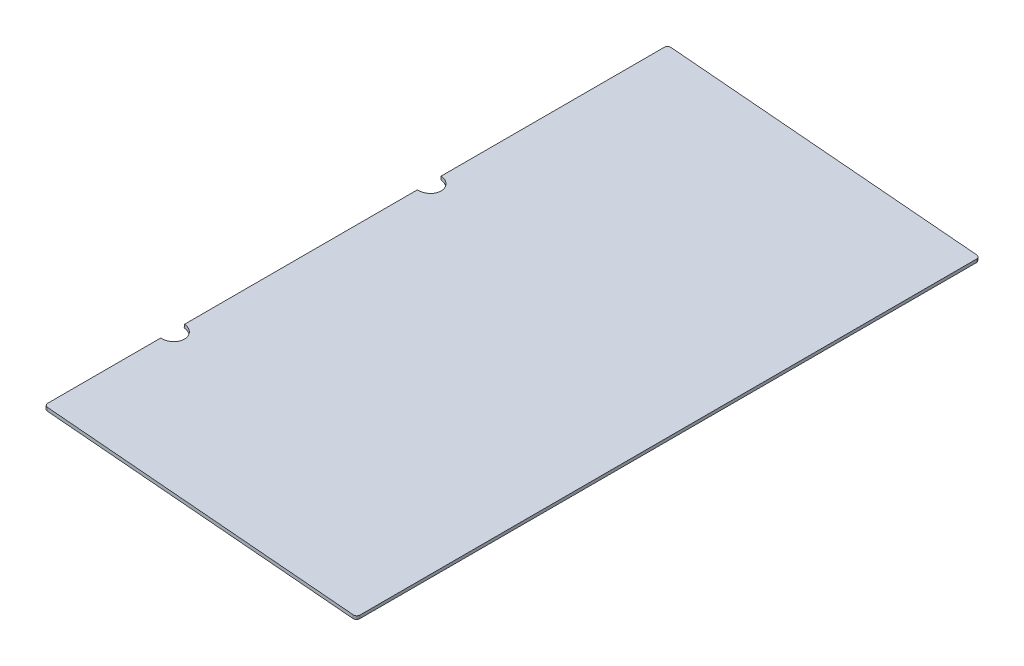
ISO-10303-21;
HEADER;
FILE_DESCRIPTION(('STEP AP214'),'2;1');
FILE_NAME('part.step','',(''),(''),'','','');
FILE_SCHEMA(('AUTOMOTIVE_DESIGN { 1 0 10303 214 1 1 1 1 }'));
ENDSEC;
DATA;
#1=APPLICATION_CONTEXT('core data for automotive mechanical design processes');
#2=APPLICATION_PROTOCOL_DEFINITION('international standard','automotive_design',2000,#1);
#3=PRODUCT_CONTEXT('',#1,'mechanical');
#4=PRODUCT('Part','Part','',(#3));
#5=PRODUCT_RELATED_PRODUCT_CATEGORY('part','',(#4));
#6=PRODUCT_DEFINITION_FORMATION('','',#4);
#7=PRODUCT_DEFINITION_CONTEXT('part definition',#1,'design');
#8=PRODUCT_DEFINITION('design','',#6,#7);
#9=PRODUCT_DEFINITION_SHAPE('','',#8);
#10=(LENGTH_UNIT() NAMED_UNIT(*) SI_UNIT(.MILLI.,.METRE.));
#11=(NAMED_UNIT(*) PLANE_ANGLE_UNIT() SI_UNIT($,.RADIAN.));
#12=(NAMED_UNIT(*) SI_UNIT($,.STERADIAN.) SOLID_ANGLE_UNIT());
#13=UNCERTAINTY_MEASURE_WITH_UNIT(LENGTH_MEASURE(1.E-05),#10,'distance_accuracy_value','');
#14=(GEOMETRIC_REPRESENTATION_CONTEXT(3) GLOBAL_UNCERTAINTY_ASSIGNED_CONTEXT((#13)) GLOBAL_UNIT_ASSIGNED_CONTEXT((#10,
#11,#12)) REPRESENTATION_CONTEXT('',''));
#15=CARTESIAN_POINT('',(0.,0.,0.));
#16=DIRECTION('',(0.,0.,1.));
#17=DIRECTION('',(1.,0.,0.));
#18=AXIS2_PLACEMENT_3D('',#15,#16,#17);
#19=CARTESIAN_POINT('',(22.7784389664476,57.5191558323467,1168.4));
#20=DIRECTION('',(0.996194698091745,-0.0871557427476619,0.));
#21=DIRECTION('',(0.0871557427476619,0.996194698091745,0.));
#22=AXIS2_PLACEMENT_3D('',#19,#20,#21);
#23=PLANE('',#22);
#24=DIRECTION('',(0.,0.,-1.));
#25=VECTOR('',#24,1.);
#26=CARTESIAN_POINT('',(22.7784389664476,57.5191558323467,1168.4));
#27=LINE('',#26,#25);
#28=CARTESIAN_POINT('',(22.7784389664476,57.5191558323467,424.65625));
#29=VERTEX_POINT('',#28);
#30=CARTESIAN_POINT('',(22.7784389664476,57.5191558323467,6.35000000000008));
#31=VERTEX_POINT('',#30);
#32=EDGE_CURVE('E164',#29,#31,#27,.T.);
#33=ORIENTED_EDGE('',*,*,#32,.T.);
#34=DIRECTION('',(-0.0871557427476619,-0.996194698091745,0.));
#35=VECTOR('',#34,1.);
#36=CARTESIAN_POINT('',(22.7784389664476,57.5191558323467,6.35000000000008));
#37=LINE('',#36,#35);
#38=CARTESIAN_POINT('',(22.225,51.1933194994641,6.35000000000008));
#39=VERTEX_POINT('',#38);
#40=EDGE_CURVE('E13',#31,#39,#37,.T.);
#41=ORIENTED_EDGE('',*,*,#40,.T.);
#42=DIRECTION('',(0.,0.,-1.));
#43=VECTOR('',#42,1.);
#44=CARTESIAN_POINT('',(22.225,51.1933194994641,1168.4));
#45=LINE('',#44,#43);
#46=CARTESIAN_POINT('',(22.225,51.1933194994641,424.65625));
#47=VERTEX_POINT('',#46);
#48=EDGE_CURVE('E178',#47,#39,#45,.T.);
#49=ORIENTED_EDGE('',*,*,#48,.F.);
#50=DIRECTION('',(0.0871557427476614,0.996194698091745,0.));
#51=VECTOR('',#50,1.);
#52=CARTESIAN_POINT('',(17.7801866800984,0.388870776980426,424.65625));
#53=LINE('',#52,#51);
#54=EDGE_CURVE('E233',#47,#29,#53,.T.);
#55=ORIENTED_EDGE('',*,*,#54,.T.);
#56=EDGE_LOOP('',(#33,#41,#49,#55));
#57=FACE_BOUND('',#56,.T.);
#58=ADVANCED_FACE('F46',(#57),#23,.F.);
#59=CARTESIAN_POINT('',(22.7784389664476,57.5191558323467,905.66875));
#60=VERTEX_POINT('',#59);
#61=CARTESIAN_POINT('',(22.7784389664476,57.5191558323467,469.10625));
#62=VERTEX_POINT('',#61);
#63=EDGE_CURVE('E154',#60,#62,#27,.T.);
#64=ORIENTED_EDGE('',*,*,#63,.T.);
#65=DIRECTION('',(0.0871557427476614,0.996194698091745,0.));
#66=VECTOR('',#65,1.);
#67=CARTESIAN_POINT('',(17.7801866800984,0.388870776980426,469.10625));
#68=LINE('',#67,#66);
#69=CARTESIAN_POINT('',(22.225,51.1933194994641,469.10625));
#70=VERTEX_POINT('',#69);
#71=EDGE_CURVE('E231',#62,#70,#68,.F.);
#72=ORIENTED_EDGE('',*,*,#71,.T.);
#73=CARTESIAN_POINT('',(22.225,51.1933194994641,905.66875));
#74=VERTEX_POINT('',#73);
#75=EDGE_CURVE('E156',#74,#70,#45,.T.);
#76=ORIENTED_EDGE('',*,*,#75,.F.);
#77=DIRECTION('',(0.0871557427476614,0.996194698091745,0.));
#78=VECTOR('',#77,1.);
#79=CARTESIAN_POINT('',(17.7801866800984,0.388870776980422,905.66875));
#80=LINE('',#79,#78);
#81=EDGE_CURVE('E140',#74,#60,#80,.T.);
#82=ORIENTED_EDGE('',*,*,#81,.T.);
#83=EDGE_LOOP('',(#64,#72,#76,#82));
#84=FACE_BOUND('',#83,.T.);
#85=ADVANCED_FACE('F152',(#84),#23,.F.);
#86=CARTESIAN_POINT('',(22.225,51.1933194994641,1162.05));
#87=VERTEX_POINT('',#86);
#88=CARTESIAN_POINT('',(22.225,51.1933194994641,950.11875));
#89=VERTEX_POINT('',#88);
#90=EDGE_CURVE('E179',#87,#89,#45,.T.);
#91=ORIENTED_EDGE('',*,*,#90,.F.);
#92=DIRECTION('',(-0.0871557427476619,-0.996194698091745,0.));
#93=VECTOR('',#92,1.);
#94=CARTESIAN_POINT('',(22.7784389664476,57.5191558323467,1162.05));
#95=LINE('',#94,#93);
#96=CARTESIAN_POINT('',(22.7784389664476,57.5191558323467,1162.05));
#97=VERTEX_POINT('',#96);
#98=EDGE_CURVE('E207',#87,#97,#95,.F.);
#99=ORIENTED_EDGE('',*,*,#98,.T.);
#100=CARTESIAN_POINT('',(22.7784389664476,57.5191558323467,950.11875));
#101=VERTEX_POINT('',#100);
#102=EDGE_CURVE('E163',#97,#101,#27,.T.);
#103=ORIENTED_EDGE('',*,*,#102,.T.);
#104=DIRECTION('',(0.0871557427476614,0.996194698091745,0.));
#105=VECTOR('',#104,1.);
#106=CARTESIAN_POINT('',(17.7801866800984,0.388870776980422,950.11875));
#107=LINE('',#106,#105);
#108=EDGE_CURVE('E143',#101,#89,#107,.F.);
#109=ORIENTED_EDGE('',*,*,#108,.T.);
#110=EDGE_LOOP('',(#91,#99,#103,#109));
#111=FACE_BOUND('',#110,.T.);
#112=ADVANCED_FACE('F258',(#111),#23,.F.);
#113=CARTESIAN_POINT('',(22.225,51.1933194994641,1168.4));
#114=DIRECTION('',(0.0871557427476615,0.996194698091745,0.));
#115=DIRECTION('',(-0.996194698091745,0.0871557427476615,0.));
#116=AXIS2_PLACEMENT_3D('',#113,#114,#115);
#117=PLANE('',#116);
#118=DIRECTION('',(0.,0.,-1.));
#119=VECTOR('',#118,1.);
#120=CARTESIAN_POINT('',(607.367319430825,0.,1168.4));
#121=LINE('',#120,#119);
#122=CARTESIAN_POINT('',(607.367319430825,0.,1162.05));
#123=VERTEX_POINT('',#122);
#124=CARTESIAN_POINT('',(607.367319430825,0.,6.35000000000008));
#125=VERTEX_POINT('',#124);
#126=EDGE_CURVE('E175',#123,#125,#121,.T.);
#127=ORIENTED_EDGE('',*,*,#126,.F.);
#128=CARTESIAN_POINT('',(601.041483097942,0.553438966447647,1162.05));
#129=DIRECTION('',(0.0871557427476615,0.996194698091745,0.));
#130=DIRECTION('',(-0.996194698091745,0.0871557427476615,0.));
#131=AXIS2_PLACEMENT_3D('',#128,#129,#130);
#132=CIRCLE('',#131,6.35);
#133=CARTESIAN_POINT('',(601.041483097942,0.553438966447634,1168.4));
#134=VERTEX_POINT('',#133);
#135=EDGE_CURVE('E205',#123,#134,#132,.F.);
#136=ORIENTED_EDGE('',*,*,#135,.T.);
#137=DIRECTION('',(0.996194698091745,-0.0871557427476615,0.));
#138=VECTOR('',#137,1.);
#139=CARTESIAN_POINT('',(22.225,51.1933194994641,1168.4));
#140=LINE('',#139,#138);
#141=CARTESIAN_POINT('',(28.5508363328826,50.6398805330165,1168.4));
#142=VERTEX_POINT('',#141);
#143=EDGE_CURVE('E216',#142,#134,#140,.T.);
#144=ORIENTED_EDGE('',*,*,#143,.F.);
#145=CARTESIAN_POINT('',(28.5508363328826,50.6398805330165,1162.05));
#146=DIRECTION('',(0.0871557427476615,0.996194698091745,0.));
#147=DIRECTION('',(-0.996194698091745,0.0871557427476615,0.));
#148=AXIS2_PLACEMENT_3D('',#145,#146,#147);
#149=CIRCLE('',#148,6.35);
#150=EDGE_CURVE('E61',#142,#87,#149,.F.);
#151=ORIENTED_EDGE('',*,*,#150,.T.);
#152=ORIENTED_EDGE('',*,*,#90,.T.);
#153=CARTESIAN_POINT('',(22.225,51.1933194994641,927.89375));
#154=DIRECTION('',(0.0871557427476615,0.996194698091745,0.));
#155=DIRECTION('',(-0.996194698091745,0.0871557427476615,0.));
#156=AXIS2_PLACEMENT_3D('',#153,#154,#155);
#157=CIRCLE('',#156,22.225);
#158=EDGE_CURVE('E225',#89,#74,#157,.T.);
#159=ORIENTED_EDGE('',*,*,#158,.T.);
#160=ORIENTED_EDGE('',*,*,#75,.T.);
#161=CARTESIAN_POINT('',(22.225,51.1933194994641,446.88125));
#162=DIRECTION('',(0.0871557427476615,0.996194698091745,0.));
#163=DIRECTION('',(-0.996194698091745,0.0871557427476615,0.));
#164=AXIS2_PLACEMENT_3D('',#161,#162,#163);
#165=CIRCLE('',#164,22.225);
#166=EDGE_CURVE('E157',#70,#47,#165,.T.);
#167=ORIENTED_EDGE('',*,*,#166,.T.);
#168=ORIENTED_EDGE('',*,*,#48,.T.);
#169=CARTESIAN_POINT('',(28.5508363328826,50.6398805330165,6.35000000000008));
#170=DIRECTION('',(0.0871557427476615,0.996194698091745,0.));
#171=DIRECTION('',(-0.996194698091745,0.0871557427476615,0.));
#172=AXIS2_PLACEMENT_3D('',#169,#170,#171);
#173=CIRCLE('',#172,6.35);
#174=CARTESIAN_POINT('',(28.5508363328826,50.6398805330165,0.));
#175=VERTEX_POINT('',#174);
#176=EDGE_CURVE('E200',#39,#175,#173,.F.);
#177=ORIENTED_EDGE('',*,*,#176,.T.);
#178=DIRECTION('',(0.996194698091745,-0.0871557427476615,0.));
#179=VECTOR('',#178,1.);
#180=CARTESIAN_POINT('',(22.225,51.1933194994641,0.));
#181=LINE('',#180,#179);
#182=CARTESIAN_POINT('',(601.041483097942,0.553438966447654,0.));
#183=VERTEX_POINT('',#182);
#184=EDGE_CURVE('E213',#175,#183,#181,.T.);
#185=ORIENTED_EDGE('',*,*,#184,.T.);
#186=CARTESIAN_POINT('',(601.041483097942,0.553438966447657,6.35000000000008));
#187=DIRECTION('',(0.0871557427476615,0.996194698091745,0.));
#188=DIRECTION('',(-0.996194698091745,0.0871557427476615,0.));
#189=AXIS2_PLACEMENT_3D('',#186,#187,#188);
#190=CIRCLE('',#189,6.35);
#191=EDGE_CURVE('E202',#183,#125,#190,.F.);
#192=ORIENTED_EDGE('',*,*,#191,.T.);
#193=EDGE_LOOP('',(#127,#136,#144,#151,#152,#159,#160,#167,#168,#177,#185,#192));
#194=FACE_BOUND('',#193,.T.);
#195=ADVANCED_FACE('F224',(#194),#117,.F.);
#196=CARTESIAN_POINT('',(607.367319430825,0.,1168.4));
#197=DIRECTION('',(-0.996194698091754,0.087155742747558,0.));
#198=DIRECTION('',(-0.087155742747558,-0.996194698091754,0.));
#199=AXIS2_PLACEMENT_3D('',#196,#197,#198);
#200=PLANE('',#199);
#201=DIRECTION('',(0.,0.,-1.));
#202=VECTOR('',#201,1.);
#203=CARTESIAN_POINT('',(607.920758397272,6.32583633288266,1168.4));
#204=LINE('',#203,#202);
#205=CARTESIAN_POINT('',(607.920758397272,6.32583633288266,1162.05));
#206=VERTEX_POINT('',#205);
#207=CARTESIAN_POINT('',(607.920758397272,6.32583633288266,6.35000000000008));
#208=VERTEX_POINT('',#207);
#209=EDGE_CURVE('E166',#206,#208,#204,.T.);
#210=ORIENTED_EDGE('',*,*,#209,.F.);
#211=DIRECTION('',(0.087155742747558,0.996194698091754,0.));
#212=VECTOR('',#211,1.);
#213=CARTESIAN_POINT('',(607.367319430825,0.,1162.05));
#214=LINE('',#213,#212);
#215=EDGE_CURVE('E198',#206,#123,#214,.F.);
#216=ORIENTED_EDGE('',*,*,#215,.T.);
#217=ORIENTED_EDGE('',*,*,#126,.T.);
#218=DIRECTION('',(0.087155742747558,0.996194698091754,0.));
#219=VECTOR('',#218,1.);
#220=CARTESIAN_POINT('',(607.367319430825,0.,6.35000000000008));
#221=LINE('',#220,#219);
#222=EDGE_CURVE('E195',#125,#208,#221,.T.);
#223=ORIENTED_EDGE('',*,*,#222,.T.);
#224=EDGE_LOOP('',(#210,#216,#217,#223));
#225=FACE_BOUND('',#224,.T.);
#226=ADVANCED_FACE('F244',(#225),#200,.F.);
#227=CARTESIAN_POINT('',(607.920758397272,6.32583633288266,1168.4));
#228=DIRECTION('',(-0.0871557427476614,-0.996194698091745,0.));
#229=DIRECTION('',(0.996194698091745,-0.0871557427476614,0.));
#230=AXIS2_PLACEMENT_3D('',#227,#228,#229);
#231=PLANE('',#230);
#232=DIRECTION('',(-0.996194698091745,0.0871557427476614,0.));
#233=VECTOR('',#232,1.);
#234=CARTESIAN_POINT('',(607.920758397272,6.32583633288266,1168.4));
#235=LINE('',#234,#233);
#236=CARTESIAN_POINT('',(601.594922064389,6.87927529933029,1168.4));
#237=VERTEX_POINT('',#236);
#238=CARTESIAN_POINT('',(29.1042752993302,56.965716865899,1168.4));
#239=VERTEX_POINT('',#238);
#240=EDGE_CURVE('E168',#237,#239,#235,.T.);
#241=ORIENTED_EDGE('',*,*,#240,.F.);
#242=CARTESIAN_POINT('',(601.594922064389,6.8792752993303,1162.05));
#243=DIRECTION('',(-0.0871557427476614,-0.996194698091745,0.));
#244=DIRECTION('',(0.996194698091745,-0.0871557427476614,0.));
#245=AXIS2_PLACEMENT_3D('',#242,#243,#244);
#246=CIRCLE('',#245,6.35);
#247=EDGE_CURVE('E193',#237,#206,#246,.F.);
#248=ORIENTED_EDGE('',*,*,#247,.T.);
#249=ORIENTED_EDGE('',*,*,#209,.T.);
#250=CARTESIAN_POINT('',(601.594922064389,6.87927529933031,6.35000000000008));
#251=DIRECTION('',(-0.0871557427476614,-0.996194698091745,0.));
#252=DIRECTION('',(0.996194698091745,-0.0871557427476614,0.));
#253=AXIS2_PLACEMENT_3D('',#250,#251,#252);
#254=CIRCLE('',#253,6.35);
#255=CARTESIAN_POINT('',(601.594922064389,6.8792752993303,0.));
#256=VERTEX_POINT('',#255);
#257=EDGE_CURVE('E189',#208,#256,#254,.F.);
#258=ORIENTED_EDGE('',*,*,#257,.T.);
#259=DIRECTION('',(-0.996194698091745,0.0871557427476614,0.));
#260=VECTOR('',#259,1.);
#261=CARTESIAN_POINT('',(607.920758397272,6.32583633288266,0.));
#262=LINE('',#261,#260);
#263=CARTESIAN_POINT('',(29.1042752993302,56.965716865899,0.));
#264=VERTEX_POINT('',#263);
#265=EDGE_CURVE('E171',#256,#264,#262,.T.);
#266=ORIENTED_EDGE('',*,*,#265,.T.);
#267=CARTESIAN_POINT('',(29.1042752993302,56.965716865899,6.35000000000008));
#268=DIRECTION('',(-0.0871557427476614,-0.996194698091745,0.));
#269=DIRECTION('',(0.996194698091745,-0.0871557427476614,0.));
#270=AXIS2_PLACEMENT_3D('',#267,#268,#269);
#271=CIRCLE('',#270,6.35);
#272=EDGE_CURVE('E187',#264,#31,#271,.F.);
#273=ORIENTED_EDGE('',*,*,#272,.T.);
#274=ORIENTED_EDGE('',*,*,#32,.F.);
#275=CARTESIAN_POINT('',(22.7784389664476,57.5191558323467,446.88125));
#276=DIRECTION('',(0.0871557427476614,0.996194698091745,0.));
#277=DIRECTION('',(-0.996194698091745,0.0871557427476614,0.));
#278=AXIS2_PLACEMENT_3D('',#275,#276,#277);
#279=CIRCLE('',#278,22.225);
#280=EDGE_CURVE('E147',#62,#29,#279,.T.);
#281=ORIENTED_EDGE('',*,*,#280,.F.);
#282=ORIENTED_EDGE('',*,*,#63,.F.);
#283=CARTESIAN_POINT('',(22.7784389664477,57.5191558323467,927.89375));
#284=DIRECTION('',(0.0871557427476614,0.996194698091745,0.));
#285=DIRECTION('',(-0.996194698091745,0.0871557427476614,0.));
#286=AXIS2_PLACEMENT_3D('',#283,#284,#285);
#287=CIRCLE('',#286,22.225);
#288=EDGE_CURVE('E136',#101,#60,#287,.T.);
#289=ORIENTED_EDGE('',*,*,#288,.F.);
#290=ORIENTED_EDGE('',*,*,#102,.F.);
#291=CARTESIAN_POINT('',(29.1042752993302,56.965716865899,1162.05));
#292=DIRECTION('',(-0.0871557427476614,-0.996194698091745,0.));
#293=DIRECTION('',(0.996194698091745,-0.0871557427476614,0.));
#294=AXIS2_PLACEMENT_3D('',#291,#292,#293);
#295=CIRCLE('',#294,6.35);
#296=EDGE_CURVE('E191',#97,#239,#295,.F.);
#297=ORIENTED_EDGE('',*,*,#296,.T.);
#298=EDGE_LOOP('',(#241,#248,#249,#258,#266,#273,#274,#281,#282,#289,#290,#297));
#299=FACE_BOUND('',#298,.T.);
#300=ADVANCED_FACE('F161',(#299),#231,.F.);
#301=CARTESIAN_POINT('',(0.,0.,1168.4));
#302=DIRECTION('',(0.,0.,1.));
#303=DIRECTION('',(1.,0.,0.));
#304=AXIS2_PLACEMENT_3D('',#301,#302,#303);
#305=PLANE('',#304);
#306=ORIENTED_EDGE('',*,*,#143,.T.);
#307=DIRECTION('',(0.087155742747558,0.996194698091754,0.));
#308=VECTOR('',#307,1.);
#309=CARTESIAN_POINT('',(601.594922064389,6.87927529932965,1168.4));
#310=LINE('',#309,#308);
#311=EDGE_CURVE('E184',#134,#237,#310,.T.);
#312=ORIENTED_EDGE('',*,*,#311,.T.);
#313=ORIENTED_EDGE('',*,*,#240,.T.);
#314=DIRECTION('',(-0.0871557427476619,-0.996194698091745,0.));
#315=VECTOR('',#314,1.);
#316=CARTESIAN_POINT('',(28.5508363328826,50.6398805330165,1168.4));
#317=LINE('',#316,#315);
#318=EDGE_CURVE('E181',#239,#142,#317,.T.);
#319=ORIENTED_EDGE('',*,*,#318,.T.);
#320=EDGE_LOOP('',(#306,#312,#313,#319));
#321=FACE_BOUND('',#320,.T.);
#322=ADVANCED_FACE('F251',(#321),#305,.T.);
#323=CARTESIAN_POINT('',(0.,0.,0.));
#324=DIRECTION('',(0.,0.,1.));
#325=DIRECTION('',(1.,0.,0.));
#326=AXIS2_PLACEMENT_3D('',#323,#324,#325);
#327=PLANE('',#326);
#328=ORIENTED_EDGE('',*,*,#265,.F.);
#329=DIRECTION('',(0.087155742747558,0.996194698091754,0.));
#330=VECTOR('',#329,1.);
#331=CARTESIAN_POINT('',(596.4278459334,-52.1806751302984,0.));
#332=LINE('',#331,#330);
#333=EDGE_CURVE('E54',#256,#183,#332,.F.);
#334=ORIENTED_EDGE('',*,*,#333,.T.);
#335=ORIENTED_EDGE('',*,*,#184,.F.);
#336=DIRECTION('',(-0.0871557427476619,-0.996194698091745,0.));
#337=VECTOR('',#336,1.);
#338=CARTESIAN_POINT('',(23.9371991683291,-2.09423356379106,0.));
#339=LINE('',#338,#337);
#340=EDGE_CURVE('E209',#175,#264,#339,.F.);
#341=ORIENTED_EDGE('',*,*,#340,.T.);
#342=EDGE_LOOP('',(#328,#334,#335,#341));
#343=FACE_BOUND('',#342,.T.);
#344=ADVANCED_FACE('F212',(#343),#327,.F.);
#345=CARTESIAN_POINT('',(17.7801866800984,0.388870776980417,927.89375));
#346=DIRECTION('',(0.0871557427476614,0.996194698091745,0.));
#347=DIRECTION('',(-0.996194698091745,0.0871557427476614,0.));
#348=AXIS2_PLACEMENT_3D('',#345,#346,#347);
#349=CYLINDRICAL_SURFACE('',#348,22.225);
#350=ORIENTED_EDGE('',*,*,#158,.F.);
#351=ORIENTED_EDGE('',*,*,#108,.F.);
#352=ORIENTED_EDGE('',*,*,#288,.T.);
#353=ORIENTED_EDGE('',*,*,#81,.F.);
#354=EDGE_LOOP('',(#350,#351,#352,#353));
#355=FACE_BOUND('',#354,.T.);
#356=ADVANCED_FACE('F139',(#355),#349,.F.);
#357=CARTESIAN_POINT('',(17.7801866800984,0.388870776980424,446.88125));
#358=DIRECTION('',(0.0871557427476614,0.996194698091745,0.));
#359=DIRECTION('',(-0.996194698091745,0.0871557427476614,0.));
#360=AXIS2_PLACEMENT_3D('',#357,#358,#359);
#361=CYLINDRICAL_SURFACE('',#360,22.225);
#362=ORIENTED_EDGE('',*,*,#166,.F.);
#363=ORIENTED_EDGE('',*,*,#71,.F.);
#364=ORIENTED_EDGE('',*,*,#280,.T.);
#365=ORIENTED_EDGE('',*,*,#54,.F.);
#366=EDGE_LOOP('',(#362,#363,#364,#365));
#367=FACE_BOUND('',#366,.T.);
#368=ADVANCED_FACE('F273',(#367),#361,.F.);
#369=CARTESIAN_POINT('',(596.4278459334,-52.1806751302984,1162.05));
#370=DIRECTION('',(-0.087155742747558,-0.996194698091754,0.));
#371=DIRECTION('',(0.996194698091754,-0.087155742747558,0.));
#372=AXIS2_PLACEMENT_3D('',#369,#370,#371);
#373=CYLINDRICAL_SURFACE('',#372,6.35);
#374=ORIENTED_EDGE('',*,*,#135,.F.);
#375=ORIENTED_EDGE('',*,*,#215,.F.);
#376=ORIENTED_EDGE('',*,*,#247,.F.);
#377=ORIENTED_EDGE('',*,*,#311,.F.);
#378=EDGE_LOOP('',(#374,#375,#376,#377));
#379=FACE_BOUND('',#378,.T.);
#380=ADVANCED_FACE('F249',(#379),#373,.T.);
#381=CARTESIAN_POINT('',(23.9371991683291,-2.09423356379106,1162.05));
#382=DIRECTION('',(0.0871557427476619,0.996194698091745,0.));
#383=DIRECTION('',(-0.996194698091745,0.0871557427476619,0.));
#384=AXIS2_PLACEMENT_3D('',#381,#382,#383);
#385=CYLINDRICAL_SURFACE('',#384,6.35);
#386=ORIENTED_EDGE('',*,*,#296,.F.);
#387=ORIENTED_EDGE('',*,*,#98,.F.);
#388=ORIENTED_EDGE('',*,*,#150,.F.);
#389=ORIENTED_EDGE('',*,*,#318,.F.);
#390=EDGE_LOOP('',(#386,#387,#388,#389));
#391=FACE_BOUND('',#390,.T.);
#392=ADVANCED_FACE('F255',(#391),#385,.T.);
#393=CARTESIAN_POINT('',(601.041483097942,0.553438966446986,6.35000000000008));
#394=DIRECTION('',(0.087155742747558,0.996194698091754,0.));
#395=DIRECTION('',(-0.996194698091754,0.087155742747558,0.));
#396=AXIS2_PLACEMENT_3D('',#393,#394,#395);
#397=CYLINDRICAL_SURFACE('',#396,6.35);
#398=ORIENTED_EDGE('',*,*,#191,.F.);
#399=ORIENTED_EDGE('',*,*,#333,.F.);
#400=ORIENTED_EDGE('',*,*,#257,.F.);
#401=ORIENTED_EDGE('',*,*,#222,.F.);
#402=EDGE_LOOP('',(#398,#399,#400,#401));
#403=FACE_BOUND('',#402,.T.);
#404=ADVANCED_FACE('F241',(#403),#397,.T.);
#405=CARTESIAN_POINT('',(29.1042752993302,56.965716865899,6.35000000000008));
#406=DIRECTION('',(-0.0871557427476619,-0.996194698091745,0.));
#407=DIRECTION('',(0.996194698091745,-0.0871557427476619,0.));
#408=AXIS2_PLACEMENT_3D('',#405,#406,#407);
#409=CYLINDRICAL_SURFACE('',#408,6.35);
#410=ORIENTED_EDGE('',*,*,#272,.F.);
#411=ORIENTED_EDGE('',*,*,#340,.F.);
#412=ORIENTED_EDGE('',*,*,#176,.F.);
#413=ORIENTED_EDGE('',*,*,#40,.F.);
#414=EDGE_LOOP('',(#410,#411,#412,#413));
#415=FACE_BOUND('',#414,.T.);
#416=ADVANCED_FACE('F48',(#415),#409,.T.);
#417=CLOSED_SHELL('',(#58,#85,#112,#195,#226,#300,#322,#344,#356,#368,#380,#392,#404,#416));
#418=MANIFOLD_SOLID_BREP('B2',#417);
#419=ADVANCED_BREP_SHAPE_REPRESENTATION('',(#18,#418),#14);
#420=SHAPE_DEFINITION_REPRESENTATION(#9,#419);
ENDSEC;
END-ISO-10303-21;
